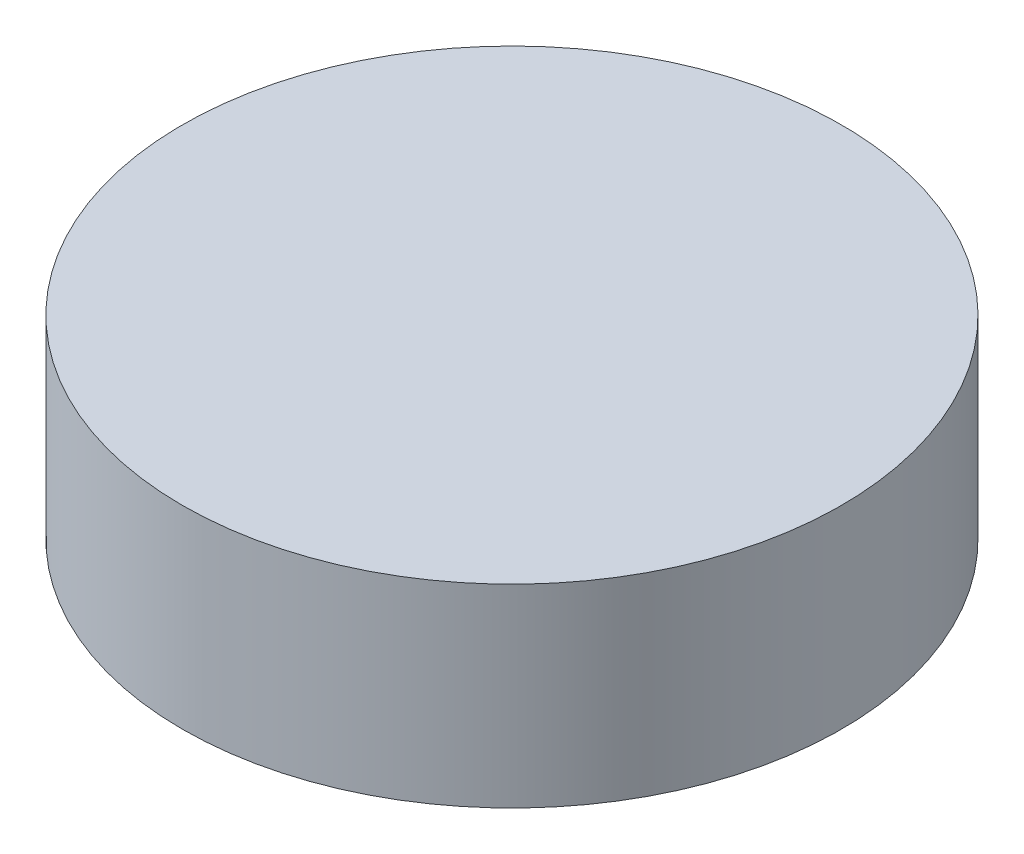
ISO-10303-21;
HEADER;
FILE_DESCRIPTION(('STEP AP214'),'2;1');
FILE_NAME('part.step','',(''),(''),'','','');
FILE_SCHEMA(('AUTOMOTIVE_DESIGN { 1 0 10303 214 1 1 1 1 }'));
ENDSEC;
DATA;
#1=APPLICATION_CONTEXT('core data for automotive mechanical design processes');
#2=APPLICATION_PROTOCOL_DEFINITION('international standard','automotive_design',2000,#1);
#3=PRODUCT_CONTEXT('',#1,'mechanical');
#4=PRODUCT('Part','Part','',(#3));
#5=PRODUCT_RELATED_PRODUCT_CATEGORY('part','',(#4));
#6=PRODUCT_DEFINITION_FORMATION('','',#4);
#7=PRODUCT_DEFINITION_CONTEXT('part definition',#1,'design');
#8=PRODUCT_DEFINITION('design','',#6,#7);
#9=PRODUCT_DEFINITION_SHAPE('','',#8);
#10=(LENGTH_UNIT() NAMED_UNIT(*) SI_UNIT(.MILLI.,.METRE.));
#11=(NAMED_UNIT(*) PLANE_ANGLE_UNIT() SI_UNIT($,.RADIAN.));
#12=(NAMED_UNIT(*) SI_UNIT($,.STERADIAN.) SOLID_ANGLE_UNIT());
#13=UNCERTAINTY_MEASURE_WITH_UNIT(LENGTH_MEASURE(1.E-05),#10,'distance_accuracy_value','');
#14=(GEOMETRIC_REPRESENTATION_CONTEXT(3) GLOBAL_UNCERTAINTY_ASSIGNED_CONTEXT((#13)) GLOBAL_UNIT_ASSIGNED_CONTEXT((#10,
#11,#12)) REPRESENTATION_CONTEXT('',''));
#15=CARTESIAN_POINT('',(0.,0.,0.));
#16=DIRECTION('',(0.,0.,1.));
#17=DIRECTION('',(1.,0.,0.));
#18=AXIS2_PLACEMENT_3D('',#15,#16,#17);
#19=CARTESIAN_POINT('',(4.99965588230111,6.35,4.96193611928675));
#20=DIRECTION('',(0.,-1.,0.));
#21=DIRECTION('',(0.,0.,-1.));
#22=AXIS2_PLACEMENT_3D('',#19,#20,#21);
#23=CYLINDRICAL_SURFACE('',#22,10.795);
#24=CARTESIAN_POINT('',(4.99965588230111,6.35,4.96193611928675));
#25=DIRECTION('',(0.,1.,0.));
#26=DIRECTION('',(0.,0.,1.));
#27=AXIS2_PLACEMENT_3D('',#24,#25,#26);
#28=CIRCLE('',#27,10.795);
#29=CARTESIAN_POINT('',(4.99965588230111,6.35,15.7569361192867));
#30=VERTEX_POINT('',#29);
#31=EDGE_CURVE('E10',#30,#30,#28,.T.);
#32=ORIENTED_EDGE('',*,*,#31,.F.);
#33=EDGE_LOOP('',(#32));
#34=FACE_BOUND('',#33,.T.);
#35=CARTESIAN_POINT('',(4.99965588230111,0.,4.96193611928675));
#36=DIRECTION('',(0.,1.,0.));
#37=DIRECTION('',(0.,0.,1.));
#38=AXIS2_PLACEMENT_3D('',#35,#36,#37);
#39=CIRCLE('',#38,10.795);
#40=CARTESIAN_POINT('',(4.99965588230111,0.,15.7569361192867));
#41=VERTEX_POINT('',#40);
#42=EDGE_CURVE('E36',#41,#41,#39,.T.);
#43=ORIENTED_EDGE('',*,*,#42,.T.);
#44=EDGE_LOOP('',(#43));
#45=FACE_BOUND('',#44,.T.);
#46=ADVANCED_FACE('F33',(#34,#45),#23,.T.);
#47=CARTESIAN_POINT('',(4.99965588230111,6.35,4.96193611928675));
#48=DIRECTION('',(0.,1.,0.));
#49=DIRECTION('',(0.,0.,1.));
#50=AXIS2_PLACEMENT_3D('',#47,#48,#49);
#51=PLANE('',#50);
#52=ORIENTED_EDGE('',*,*,#31,.T.);
#53=EDGE_LOOP('',(#52));
#54=FACE_BOUND('',#53,.T.);
#55=ADVANCED_FACE('F48',(#54),#51,.T.);
#56=CARTESIAN_POINT('',(4.99965588230111,0.,4.96193611928675));
#57=DIRECTION('',(0.,1.,0.));
#58=DIRECTION('',(0.,0.,1.));
#59=AXIS2_PLACEMENT_3D('',#56,#57,#58);
#60=PLANE('',#59);
#61=ORIENTED_EDGE('',*,*,#42,.F.);
#62=EDGE_LOOP('',(#61));
#63=FACE_BOUND('',#62,.T.);
#64=ADVANCED_FACE('F46',(#63),#60,.F.);
#65=CLOSED_SHELL('',(#46,#55,#64));
#66=MANIFOLD_SOLID_BREP('B2',#65);
#67=ADVANCED_BREP_SHAPE_REPRESENTATION('',(#18,#66),#14);
#68=SHAPE_DEFINITION_REPRESENTATION(#9,#67);
ENDSEC;
END-ISO-10303-21;
